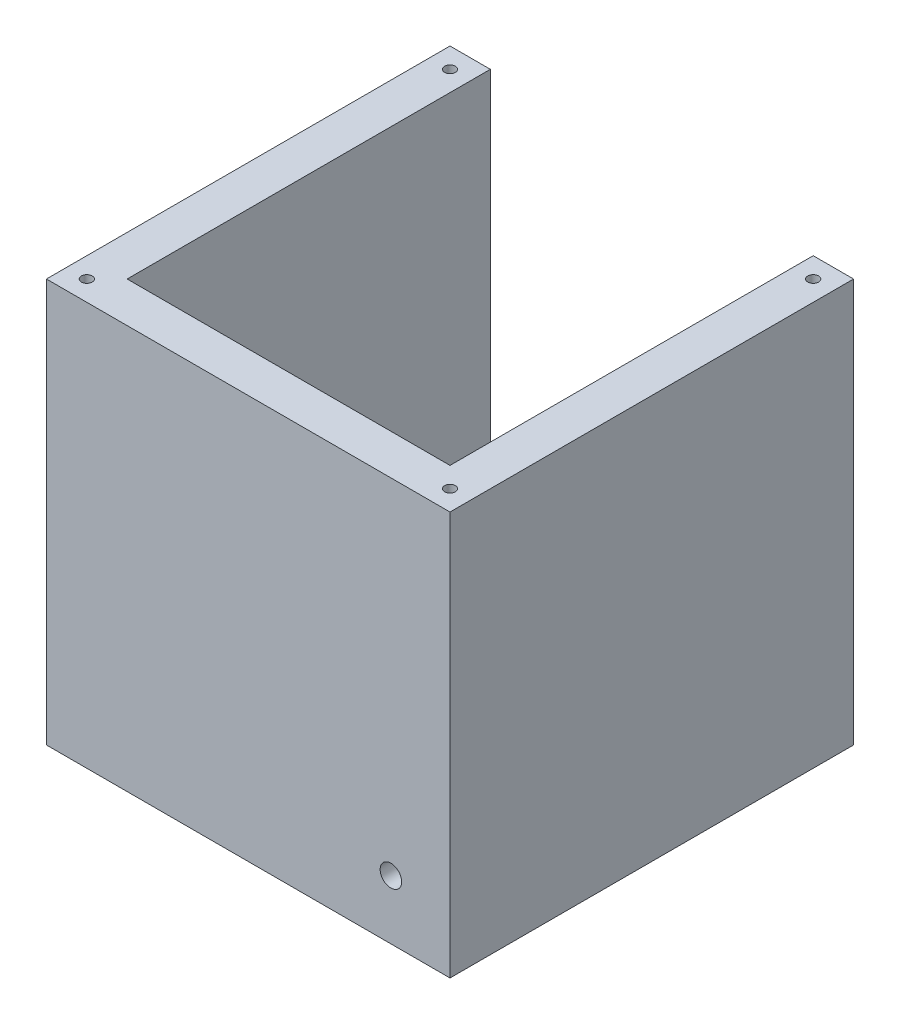
ISO-10303-21;
HEADER;
FILE_DESCRIPTION(('STEP AP214'),'2;1');
FILE_NAME('part.step','',(''),(''),'','','');
FILE_SCHEMA(('AUTOMOTIVE_DESIGN { 1 0 10303 214 1 1 1 1 }'));
ENDSEC;
DATA;
#1=APPLICATION_CONTEXT('core data for automotive mechanical design processes');
#2=APPLICATION_PROTOCOL_DEFINITION('international standard','automotive_design',2000,#1);
#3=PRODUCT_CONTEXT('',#1,'mechanical');
#4=PRODUCT('Part','Part','',(#3));
#5=PRODUCT_RELATED_PRODUCT_CATEGORY('part','',(#4));
#6=PRODUCT_DEFINITION_FORMATION('','',#4);
#7=PRODUCT_DEFINITION_CONTEXT('part definition',#1,'design');
#8=PRODUCT_DEFINITION('design','',#6,#7);
#9=PRODUCT_DEFINITION_SHAPE('','',#8);
#10=(LENGTH_UNIT() NAMED_UNIT(*) SI_UNIT(.MILLI.,.METRE.));
#11=(NAMED_UNIT(*) PLANE_ANGLE_UNIT() SI_UNIT($,.RADIAN.));
#12=(NAMED_UNIT(*) SI_UNIT($,.STERADIAN.) SOLID_ANGLE_UNIT());
#13=UNCERTAINTY_MEASURE_WITH_UNIT(LENGTH_MEASURE(1.E-05),#10,'distance_accuracy_value','');
#14=(GEOMETRIC_REPRESENTATION_CONTEXT(3) GLOBAL_UNCERTAINTY_ASSIGNED_CONTEXT((#13)) GLOBAL_UNIT_ASSIGNED_CONTEXT((#10,
#11,#12)) REPRESENTATION_CONTEXT('',''));
#15=CARTESIAN_POINT('',(0.,0.,0.));
#16=DIRECTION('',(0.,0.,1.));
#17=DIRECTION('',(1.,0.,0.));
#18=AXIS2_PLACEMENT_3D('',#15,#16,#17);
#19=CARTESIAN_POINT('',(67.4999999999995,65.,7.49999999999998));
#20=DIRECTION('',(0.,1.,0.));
#21=DIRECTION('',(0.,0.,1.));
#22=AXIS2_PLACEMENT_3D('',#19,#20,#21);
#23=CYLINDRICAL_SURFACE('',#22,2.00000000000001);
#24=CARTESIAN_POINT('',(67.4999999999995,75.,7.49999999999998));
#25=DIRECTION('',(0.,1.,0.));
#26=DIRECTION('',(0.,0.,1.));
#27=AXIS2_PLACEMENT_3D('',#24,#25,#26);
#28=CIRCLE('',#27,2.00000000000001);
#29=CARTESIAN_POINT('',(67.4999999999995,75.,9.49999999999999));
#30=VERTEX_POINT('',#29);
#31=EDGE_CURVE('E202',#30,#30,#28,.T.);
#32=ORIENTED_EDGE('',*,*,#31,.T.);
#33=EDGE_LOOP('',(#32));
#34=FACE_BOUND('',#33,.T.);
#35=CARTESIAN_POINT('',(67.5,67.5,7.49999999999998));
#36=DIRECTION('',(0.,0.707106781186547,0.707106781186547));
#37=DIRECTION('',(0.,0.707106781186547,-0.707106781186547));
#38=AXIS2_PLACEMENT_3D('',#35,#36,#37);
#39=ELLIPSE('',#38,2.8284271247462,2.00000000000001);
#40=CARTESIAN_POINT('',(65.5,67.5,7.49999999999998));
#41=VERTEX_POINT('',#40);
#42=CARTESIAN_POINT('',(69.5,67.5,7.49999999999998));
#43=VERTEX_POINT('',#42);
#44=EDGE_CURVE('E46',#41,#43,#39,.F.);
#45=ORIENTED_EDGE('',*,*,#44,.T.);
#46=CARTESIAN_POINT('',(67.5,67.5,7.49999999999998));
#47=DIRECTION('',(0.,0.707106781186547,-0.707106781186547));
#48=DIRECTION('',(0.,0.707106781186547,0.707106781186547));
#49=AXIS2_PLACEMENT_3D('',#46,#47,#48);
#50=ELLIPSE('',#49,2.8284271247462,2.00000000000001);
#51=EDGE_CURVE('E11',#43,#41,#50,.F.);
#52=ORIENTED_EDGE('',*,*,#51,.T.);
#53=EDGE_LOOP('',(#45,#52));
#54=FACE_BOUND('',#53,.T.);
#55=ADVANCED_FACE('F33',(#34,#54),#23,.F.);
#56=CARTESIAN_POINT('',(-67.5000000000005,65.,7.49999999999998));
#57=DIRECTION('',(0.,1.,0.));
#58=DIRECTION('',(0.,0.,1.));
#59=AXIS2_PLACEMENT_3D('',#56,#57,#58);
#60=CYLINDRICAL_SURFACE('',#59,2.00000000000001);
#61=CARTESIAN_POINT('',(-67.5000000000005,75.,7.49999999999998));
#62=DIRECTION('',(0.,1.,0.));
#63=DIRECTION('',(0.,0.,1.));
#64=AXIS2_PLACEMENT_3D('',#61,#62,#63);
#65=CIRCLE('',#64,2.00000000000001);
#66=CARTESIAN_POINT('',(-67.5000000000005,75.,9.49999999999999));
#67=VERTEX_POINT('',#66);
#68=EDGE_CURVE('E208',#67,#67,#65,.T.);
#69=ORIENTED_EDGE('',*,*,#68,.T.);
#70=EDGE_LOOP('',(#69));
#71=FACE_BOUND('',#70,.T.);
#72=CARTESIAN_POINT('',(-67.5,67.5,7.49999999999998));
#73=DIRECTION('',(0.,0.707106781186547,0.707106781186547));
#74=DIRECTION('',(0.,0.707106781186547,-0.707106781186547));
#75=AXIS2_PLACEMENT_3D('',#72,#73,#74);
#76=ELLIPSE('',#75,2.8284271247462,2.00000000000001);
#77=CARTESIAN_POINT('',(-69.5,67.5,7.49999999999998));
#78=VERTEX_POINT('',#77);
#79=CARTESIAN_POINT('',(-65.5,67.5,7.49999999999998));
#80=VERTEX_POINT('',#79);
#81=EDGE_CURVE('E53',#78,#80,#76,.F.);
#82=ORIENTED_EDGE('',*,*,#81,.T.);
#83=CARTESIAN_POINT('',(-67.5,67.5,7.49999999999998));
#84=DIRECTION('',(0.,0.707106781186547,-0.707106781186547));
#85=DIRECTION('',(0.,0.707106781186547,0.707106781186547));
#86=AXIS2_PLACEMENT_3D('',#83,#84,#85);
#87=ELLIPSE('',#86,2.8284271247462,2.00000000000001);
#88=EDGE_CURVE('E118',#80,#78,#87,.F.);
#89=ORIENTED_EDGE('',*,*,#88,.T.);
#90=EDGE_LOOP('',(#82,#89));
#91=FACE_BOUND('',#90,.T.);
#92=ADVANCED_FACE('F304',(#71,#91),#60,.F.);
#93=CARTESIAN_POINT('',(-75.,75.,150.));
#94=DIRECTION('',(0.,-1.,0.));
#95=DIRECTION('',(0.,0.,-1.));
#96=AXIS2_PLACEMENT_3D('',#93,#94,#95);
#97=PLANE('',#96);
#98=ORIENTED_EDGE('',*,*,#68,.F.);
#99=EDGE_LOOP('',(#98));
#100=FACE_BOUND('',#99,.T.);
#101=ORIENTED_EDGE('',*,*,#31,.F.);
#102=EDGE_LOOP('',(#101));
#103=FACE_BOUND('',#102,.T.);
#104=CARTESIAN_POINT('',(67.5,75.,142.5));
#105=DIRECTION('',(0.,1.,0.));
#106=DIRECTION('',(0.,0.,1.));
#107=AXIS2_PLACEMENT_3D('',#104,#105,#106);
#108=CIRCLE('',#107,2.00000000000001);
#109=CARTESIAN_POINT('',(67.5,75.,144.5));
#110=VERTEX_POINT('',#109);
#111=EDGE_CURVE('E196',#110,#110,#108,.T.);
#112=ORIENTED_EDGE('',*,*,#111,.F.);
#113=EDGE_LOOP('',(#112));
#114=FACE_BOUND('',#113,.T.);
#115=CARTESIAN_POINT('',(-67.5,75.,142.5));
#116=DIRECTION('',(0.,1.,0.));
#117=DIRECTION('',(0.,0.,1.));
#118=AXIS2_PLACEMENT_3D('',#115,#116,#117);
#119=CIRCLE('',#118,2.00000000000001);
#120=CARTESIAN_POINT('',(-67.5,75.,144.5));
#121=VERTEX_POINT('',#120);
#122=EDGE_CURVE('E193',#121,#121,#119,.T.);
#123=ORIENTED_EDGE('',*,*,#122,.F.);
#124=EDGE_LOOP('',(#123));
#125=FACE_BOUND('',#124,.T.);
#126=DIRECTION('',(0.,0.,-1.));
#127=VECTOR('',#126,1.);
#128=CARTESIAN_POINT('',(-60.,75.,135.));
#129=LINE('',#128,#127);
#130=CARTESIAN_POINT('',(-60.,75.,135.));
#131=VERTEX_POINT('',#130);
#132=CARTESIAN_POINT('',(-60.,75.,0.));
#133=VERTEX_POINT('',#132);
#134=EDGE_CURVE('E164',#131,#133,#129,.T.);
#135=ORIENTED_EDGE('',*,*,#134,.T.);
#136=DIRECTION('',(-1.,0.,0.));
#137=VECTOR('',#136,1.);
#138=CARTESIAN_POINT('',(-75.,75.,0.));
#139=LINE('',#138,#137);
#140=CARTESIAN_POINT('',(-75.,75.,0.));
#141=VERTEX_POINT('',#140);
#142=EDGE_CURVE('E152',#133,#141,#139,.T.);
#143=ORIENTED_EDGE('',*,*,#142,.T.);
#144=DIRECTION('',(0.,0.,-1.));
#145=VECTOR('',#144,1.);
#146=CARTESIAN_POINT('',(-75.,75.,150.));
#147=LINE('',#146,#145);
#148=CARTESIAN_POINT('',(-75.,75.,150.));
#149=VERTEX_POINT('',#148);
#150=EDGE_CURVE('E134',#149,#141,#147,.T.);
#151=ORIENTED_EDGE('',*,*,#150,.F.);
#152=DIRECTION('',(-1.,0.,0.));
#153=VECTOR('',#152,1.);
#154=CARTESIAN_POINT('',(-75.,75.,150.));
#155=LINE('',#154,#153);
#156=CARTESIAN_POINT('',(75.,75.,150.));
#157=VERTEX_POINT('',#156);
#158=EDGE_CURVE('E160',#157,#149,#155,.T.);
#159=ORIENTED_EDGE('',*,*,#158,.F.);
#160=DIRECTION('',(0.,0.,-1.));
#161=VECTOR('',#160,1.);
#162=CARTESIAN_POINT('',(75.,75.,150.));
#163=LINE('',#162,#161);
#164=CARTESIAN_POINT('',(75.,75.,0.));
#165=VERTEX_POINT('',#164);
#166=EDGE_CURVE('E131',#157,#165,#163,.T.);
#167=ORIENTED_EDGE('',*,*,#166,.T.);
#168=CARTESIAN_POINT('',(60.,75.,0.));
#169=VERTEX_POINT('',#168);
#170=EDGE_CURVE('E149',#165,#169,#139,.T.);
#171=ORIENTED_EDGE('',*,*,#170,.T.);
#172=DIRECTION('',(0.,0.,-1.));
#173=VECTOR('',#172,1.);
#174=CARTESIAN_POINT('',(60.,75.,135.));
#175=LINE('',#174,#173);
#176=CARTESIAN_POINT('',(60.,75.,135.));
#177=VERTEX_POINT('',#176);
#178=EDGE_CURVE('E167',#177,#169,#175,.T.);
#179=ORIENTED_EDGE('',*,*,#178,.F.);
#180=DIRECTION('',(1.,0.,0.));
#181=VECTOR('',#180,1.);
#182=CARTESIAN_POINT('',(0.,75.,135.));
#183=LINE('',#182,#181);
#184=EDGE_CURVE('E188',#131,#177,#183,.T.);
#185=ORIENTED_EDGE('',*,*,#184,.F.);
#186=EDGE_LOOP('',(#135,#143,#151,#159,#167,#171,#179,#185));
#187=FACE_BOUND('',#186,.T.);
#188=ADVANCED_FACE('F271',(#100,#103,#114,#125,#187),#97,.F.);
#189=CARTESIAN_POINT('',(0.,0.,0.));
#190=DIRECTION('',(0.,0.,-1.));
#191=DIRECTION('',(-1.,0.,0.));
#192=AXIS2_PLACEMENT_3D('',#189,#190,#191);
#193=PLANE('',#192);
#194=CARTESIAN_POINT('',(67.5000000000005,67.5,0.));
#195=DIRECTION('',(0.,0.,-1.));
#196=DIRECTION('',(-1.,0.,0.));
#197=AXIS2_PLACEMENT_3D('',#194,#195,#196);
#198=CIRCLE('',#197,2.00000000000001);
#199=CARTESIAN_POINT('',(65.5000000000004,67.5,0.));
#200=VERTEX_POINT('',#199);
#201=EDGE_CURVE('E232',#200,#200,#198,.T.);
#202=ORIENTED_EDGE('',*,*,#201,.F.);
#203=EDGE_LOOP('',(#202));
#204=FACE_BOUND('',#203,.T.);
#205=CARTESIAN_POINT('',(-67.4999999999995,67.5,0.));
#206=DIRECTION('',(0.,0.,-1.));
#207=DIRECTION('',(-1.,0.,0.));
#208=AXIS2_PLACEMENT_3D('',#205,#206,#207);
#209=CIRCLE('',#208,2.00000000000001);
#210=CARTESIAN_POINT('',(-69.4999999999996,67.5,0.));
#211=VERTEX_POINT('',#210);
#212=EDGE_CURVE('E226',#211,#211,#209,.T.);
#213=ORIENTED_EDGE('',*,*,#212,.F.);
#214=EDGE_LOOP('',(#213));
#215=FACE_BOUND('',#214,.T.);
#216=CARTESIAN_POINT('',(-67.5,-67.5,0.));
#217=DIRECTION('',(0.,0.,-1.));
#218=DIRECTION('',(-1.,0.,0.));
#219=AXIS2_PLACEMENT_3D('',#216,#217,#218);
#220=CIRCLE('',#219,2.00000000000001);
#221=CARTESIAN_POINT('',(-69.5,-67.5,0.));
#222=VERTEX_POINT('',#221);
#223=EDGE_CURVE('E220',#222,#222,#220,.T.);
#224=ORIENTED_EDGE('',*,*,#223,.F.);
#225=EDGE_LOOP('',(#224));
#226=FACE_BOUND('',#225,.T.);
#227=CARTESIAN_POINT('',(67.5,-67.5,0.));
#228=DIRECTION('',(0.,0.,-1.));
#229=DIRECTION('',(-1.,0.,0.));
#230=AXIS2_PLACEMENT_3D('',#227,#228,#229);
#231=CIRCLE('',#230,2.00000000000001);
#232=CARTESIAN_POINT('',(65.5,-67.5,0.));
#233=VERTEX_POINT('',#232);
#234=EDGE_CURVE('E217',#233,#233,#231,.T.);
#235=ORIENTED_EDGE('',*,*,#234,.F.);
#236=EDGE_LOOP('',(#235));
#237=FACE_BOUND('',#236,.T.);
#238=ORIENTED_EDGE('',*,*,#142,.F.);
#239=DIRECTION('',(0.,-1.,0.));
#240=VECTOR('',#239,1.);
#241=CARTESIAN_POINT('',(-60.,0.,0.));
#242=LINE('',#241,#240);
#243=CARTESIAN_POINT('',(-60.,-60.,0.));
#244=VERTEX_POINT('',#243);
#245=EDGE_CURVE('E181',#133,#244,#242,.T.);
#246=ORIENTED_EDGE('',*,*,#245,.T.);
#247=DIRECTION('',(1.,0.,0.));
#248=VECTOR('',#247,1.);
#249=CARTESIAN_POINT('',(0.,-60.,0.));
#250=LINE('',#249,#248);
#251=CARTESIAN_POINT('',(60.,-60.,0.));
#252=VERTEX_POINT('',#251);
#253=EDGE_CURVE('E174',#244,#252,#250,.T.);
#254=ORIENTED_EDGE('',*,*,#253,.T.);
#255=DIRECTION('',(0.,1.,0.));
#256=VECTOR('',#255,1.);
#257=CARTESIAN_POINT('',(60.,0.,0.));
#258=LINE('',#257,#256);
#259=EDGE_CURVE('E178',#252,#169,#258,.T.);
#260=ORIENTED_EDGE('',*,*,#259,.T.);
#261=ORIENTED_EDGE('',*,*,#170,.F.);
#262=DIRECTION('',(0.,1.,0.));
#263=VECTOR('',#262,1.);
#264=CARTESIAN_POINT('',(75.,-75.,0.));
#265=LINE('',#264,#263);
#266=CARTESIAN_POINT('',(75.,-75.,0.));
#267=VERTEX_POINT('',#266);
#268=EDGE_CURVE('E153',#267,#165,#265,.T.);
#269=ORIENTED_EDGE('',*,*,#268,.F.);
#270=DIRECTION('',(1.,0.,0.));
#271=VECTOR('',#270,1.);
#272=CARTESIAN_POINT('',(-75.,-75.,0.));
#273=LINE('',#272,#271);
#274=CARTESIAN_POINT('',(-75.,-75.,0.));
#275=VERTEX_POINT('',#274);
#276=EDGE_CURVE('E144',#275,#267,#273,.T.);
#277=ORIENTED_EDGE('',*,*,#276,.F.);
#278=DIRECTION('',(0.,-1.,0.));
#279=VECTOR('',#278,1.);
#280=CARTESIAN_POINT('',(-75.,-75.,0.));
#281=LINE('',#280,#279);
#282=EDGE_CURVE('E147',#141,#275,#281,.T.);
#283=ORIENTED_EDGE('',*,*,#282,.F.);
#284=EDGE_LOOP('',(#238,#246,#254,#260,#261,#269,#277,#283));
#285=FACE_BOUND('',#284,.T.);
#286=ADVANCED_FACE('F282',(#204,#215,#226,#237,#285),#193,.T.);
#287=CARTESIAN_POINT('',(75.,-75.,150.));
#288=DIRECTION('',(-1.,0.,0.));
#289=DIRECTION('',(0.,-1.,0.));
#290=AXIS2_PLACEMENT_3D('',#287,#288,#289);
#291=PLANE('',#290);
#292=ORIENTED_EDGE('',*,*,#268,.T.);
#293=ORIENTED_EDGE('',*,*,#166,.F.);
#294=DIRECTION('',(0.,1.,0.));
#295=VECTOR('',#294,1.);
#296=CARTESIAN_POINT('',(75.,-75.,150.));
#297=LINE('',#296,#295);
#298=CARTESIAN_POINT('',(75.,-75.,150.));
#299=VERTEX_POINT('',#298);
#300=EDGE_CURVE('E146',#299,#157,#297,.T.);
#301=ORIENTED_EDGE('',*,*,#300,.F.);
#302=DIRECTION('',(0.,0.,-1.));
#303=VECTOR('',#302,1.);
#304=CARTESIAN_POINT('',(75.,-75.,150.));
#305=LINE('',#304,#303);
#306=EDGE_CURVE('E140',#299,#267,#305,.T.);
#307=ORIENTED_EDGE('',*,*,#306,.T.);
#308=EDGE_LOOP('',(#292,#293,#301,#307));
#309=FACE_BOUND('',#308,.T.);
#310=ADVANCED_FACE('F35',(#309),#291,.F.);
#311=CARTESIAN_POINT('',(-75.,-75.,150.));
#312=DIRECTION('',(1.,0.,0.));
#313=DIRECTION('',(0.,1.,0.));
#314=AXIS2_PLACEMENT_3D('',#311,#312,#313);
#315=PLANE('',#314);
#316=ORIENTED_EDGE('',*,*,#282,.T.);
#317=DIRECTION('',(0.,0.,-1.));
#318=VECTOR('',#317,1.);
#319=CARTESIAN_POINT('',(-75.,-75.,150.));
#320=LINE('',#319,#318);
#321=CARTESIAN_POINT('',(-75.,-75.,150.));
#322=VERTEX_POINT('',#321);
#323=EDGE_CURVE('E137',#322,#275,#320,.T.);
#324=ORIENTED_EDGE('',*,*,#323,.F.);
#325=DIRECTION('',(0.,-1.,0.));
#326=VECTOR('',#325,1.);
#327=CARTESIAN_POINT('',(-75.,-75.,150.));
#328=LINE('',#327,#326);
#329=EDGE_CURVE('E158',#149,#322,#328,.T.);
#330=ORIENTED_EDGE('',*,*,#329,.F.);
#331=ORIENTED_EDGE('',*,*,#150,.T.);
#332=EDGE_LOOP('',(#316,#324,#330,#331));
#333=FACE_BOUND('',#332,.T.);
#334=ADVANCED_FACE('F278',(#333),#315,.F.);
#335=CARTESIAN_POINT('',(-75.,-75.,150.));
#336=DIRECTION('',(0.,1.,0.));
#337=DIRECTION('',(0.,0.,1.));
#338=AXIS2_PLACEMENT_3D('',#335,#336,#337);
#339=PLANE('',#338);
#340=ORIENTED_EDGE('',*,*,#276,.T.);
#341=ORIENTED_EDGE('',*,*,#306,.F.);
#342=DIRECTION('',(1.,0.,0.));
#343=VECTOR('',#342,1.);
#344=CARTESIAN_POINT('',(-75.,-75.,150.));
#345=LINE('',#344,#343);
#346=EDGE_CURVE('E143',#322,#299,#345,.T.);
#347=ORIENTED_EDGE('',*,*,#346,.F.);
#348=ORIENTED_EDGE('',*,*,#323,.T.);
#349=EDGE_LOOP('',(#340,#341,#347,#348));
#350=FACE_BOUND('',#349,.T.);
#351=ADVANCED_FACE('F261',(#350),#339,.F.);
#352=CARTESIAN_POINT('',(0.,0.,150.));
#353=DIRECTION('',(0.,0.,-1.));
#354=DIRECTION('',(-1.,0.,0.));
#355=AXIS2_PLACEMENT_3D('',#352,#353,#354);
#356=PLANE('',#355);
#357=CARTESIAN_POINT('',(53.0330085889911,-53.0330085889911,150.));
#358=DIRECTION('',(0.,0.,1.));
#359=DIRECTION('',(1.,0.,0.));
#360=AXIS2_PLACEMENT_3D('',#357,#358,#359);
#361=CIRCLE('',#360,4.);
#362=CARTESIAN_POINT('',(57.0330085889911,-53.0330085889911,150.));
#363=VERTEX_POINT('',#362);
#364=EDGE_CURVE('E241',#363,#363,#361,.T.);
#365=ORIENTED_EDGE('',*,*,#364,.F.);
#366=EDGE_LOOP('',(#365));
#367=FACE_BOUND('',#366,.T.);
#368=ORIENTED_EDGE('',*,*,#300,.T.);
#369=ORIENTED_EDGE('',*,*,#158,.T.);
#370=ORIENTED_EDGE('',*,*,#329,.T.);
#371=ORIENTED_EDGE('',*,*,#346,.T.);
#372=EDGE_LOOP('',(#368,#369,#370,#371));
#373=FACE_BOUND('',#372,.T.);
#374=ADVANCED_FACE('F257',(#367,#373),#356,.F.);
#375=CARTESIAN_POINT('',(-60.,0.,135.));
#376=DIRECTION('',(1.,0.,0.));
#377=DIRECTION('',(0.,0.,-1.));
#378=AXIS2_PLACEMENT_3D('',#375,#376,#377);
#379=PLANE('',#378);
#380=ORIENTED_EDGE('',*,*,#245,.F.);
#381=ORIENTED_EDGE('',*,*,#134,.F.);
#382=DIRECTION('',(0.,-1.,0.));
#383=VECTOR('',#382,1.);
#384=CARTESIAN_POINT('',(-60.,0.,135.));
#385=LINE('',#384,#383);
#386=CARTESIAN_POINT('',(-60.,-60.,135.));
#387=VERTEX_POINT('',#386);
#388=EDGE_CURVE('E177',#131,#387,#385,.T.);
#389=ORIENTED_EDGE('',*,*,#388,.T.);
#390=DIRECTION('',(0.,0.,-1.));
#391=VECTOR('',#390,1.);
#392=CARTESIAN_POINT('',(-60.,-60.,135.));
#393=LINE('',#392,#391);
#394=EDGE_CURVE('E156',#387,#244,#393,.T.);
#395=ORIENTED_EDGE('',*,*,#394,.T.);
#396=EDGE_LOOP('',(#380,#381,#389,#395));
#397=FACE_BOUND('',#396,.T.);
#398=ADVANCED_FACE('F260',(#397),#379,.T.);
#399=CARTESIAN_POINT('',(0.,-60.,135.));
#400=DIRECTION('',(0.,1.,0.));
#401=DIRECTION('',(0.,0.,1.));
#402=AXIS2_PLACEMENT_3D('',#399,#400,#401);
#403=PLANE('',#402);
#404=ORIENTED_EDGE('',*,*,#253,.F.);
#405=ORIENTED_EDGE('',*,*,#394,.F.);
#406=DIRECTION('',(1.,0.,0.));
#407=VECTOR('',#406,1.);
#408=CARTESIAN_POINT('',(0.,-60.,135.));
#409=LINE('',#408,#407);
#410=CARTESIAN_POINT('',(60.,-60.,135.));
#411=VERTEX_POINT('',#410);
#412=EDGE_CURVE('E168',#387,#411,#409,.T.);
#413=ORIENTED_EDGE('',*,*,#412,.T.);
#414=DIRECTION('',(0.,0.,-1.));
#415=VECTOR('',#414,1.);
#416=CARTESIAN_POINT('',(60.,-60.,135.));
#417=LINE('',#416,#415);
#418=EDGE_CURVE('E170',#411,#252,#417,.T.);
#419=ORIENTED_EDGE('',*,*,#418,.T.);
#420=EDGE_LOOP('',(#404,#405,#413,#419));
#421=FACE_BOUND('',#420,.T.);
#422=ADVANCED_FACE('F293',(#421),#403,.T.);
#423=CARTESIAN_POINT('',(60.,0.,135.));
#424=DIRECTION('',(-1.,0.,0.));
#425=DIRECTION('',(0.,0.,1.));
#426=AXIS2_PLACEMENT_3D('',#423,#424,#425);
#427=PLANE('',#426);
#428=ORIENTED_EDGE('',*,*,#259,.F.);
#429=ORIENTED_EDGE('',*,*,#418,.F.);
#430=DIRECTION('',(0.,1.,0.));
#431=VECTOR('',#430,1.);
#432=CARTESIAN_POINT('',(60.,0.,135.));
#433=LINE('',#432,#431);
#434=EDGE_CURVE('E186',#411,#177,#433,.T.);
#435=ORIENTED_EDGE('',*,*,#434,.T.);
#436=ORIENTED_EDGE('',*,*,#178,.T.);
#437=EDGE_LOOP('',(#428,#429,#435,#436));
#438=FACE_BOUND('',#437,.T.);
#439=ADVANCED_FACE('F286',(#438),#427,.T.);
#440=CARTESIAN_POINT('',(0.,0.,135.));
#441=DIRECTION('',(0.,0.,-1.));
#442=DIRECTION('',(-1.,0.,0.));
#443=AXIS2_PLACEMENT_3D('',#440,#441,#442);
#444=PLANE('',#443);
#445=CARTESIAN_POINT('',(53.0330085889911,-53.0330085889911,135.));
#446=DIRECTION('',(0.,0.,1.));
#447=DIRECTION('',(1.,0.,0.));
#448=AXIS2_PLACEMENT_3D('',#445,#446,#447);
#449=CIRCLE('',#448,4.);
#450=CARTESIAN_POINT('',(57.0330085889911,-53.0330085889911,135.));
#451=VERTEX_POINT('',#450);
#452=EDGE_CURVE('E238',#451,#451,#449,.T.);
#453=ORIENTED_EDGE('',*,*,#452,.T.);
#454=EDGE_LOOP('',(#453));
#455=FACE_BOUND('',#454,.T.);
#456=ORIENTED_EDGE('',*,*,#388,.F.);
#457=ORIENTED_EDGE('',*,*,#184,.T.);
#458=ORIENTED_EDGE('',*,*,#434,.F.);
#459=ORIENTED_EDGE('',*,*,#412,.F.);
#460=EDGE_LOOP('',(#456,#457,#458,#459));
#461=FACE_BOUND('',#460,.T.);
#462=ADVANCED_FACE('F247',(#455,#461),#444,.T.);
#463=CARTESIAN_POINT('',(-67.5,65.,142.5));
#464=DIRECTION('',(0.,1.,0.));
#465=DIRECTION('',(0.,0.,1.));
#466=AXIS2_PLACEMENT_3D('',#463,#464,#465);
#467=CYLINDRICAL_SURFACE('',#466,2.00000000000001);
#468=CARTESIAN_POINT('',(-67.5,65.,142.5));
#469=DIRECTION('',(0.,1.,0.));
#470=DIRECTION('',(0.,0.,1.));
#471=AXIS2_PLACEMENT_3D('',#468,#469,#470);
#472=CIRCLE('',#471,2.00000000000001);
#473=CARTESIAN_POINT('',(-67.5,65.,144.5));
#474=VERTEX_POINT('',#473);
#475=EDGE_CURVE('E184',#474,#474,#472,.T.);
#476=ORIENTED_EDGE('',*,*,#475,.F.);
#477=EDGE_LOOP('',(#476));
#478=FACE_BOUND('',#477,.T.);
#479=ORIENTED_EDGE('',*,*,#122,.T.);
#480=EDGE_LOOP('',(#479));
#481=FACE_BOUND('',#480,.T.);
#482=ADVANCED_FACE('F342',(#478,#481),#467,.F.);
#483=CARTESIAN_POINT('',(-67.5,65.,142.5));
#484=DIRECTION('',(0.,1.,0.));
#485=DIRECTION('',(0.,0.,1.));
#486=AXIS2_PLACEMENT_3D('',#483,#484,#485);
#487=PLANE('',#486);
#488=ORIENTED_EDGE('',*,*,#475,.T.);
#489=EDGE_LOOP('',(#488));
#490=FACE_BOUND('',#489,.T.);
#491=ADVANCED_FACE('F334',(#490),#487,.T.);
#492=CARTESIAN_POINT('',(67.5,65.,142.5));
#493=DIRECTION('',(0.,1.,0.));
#494=DIRECTION('',(0.,0.,1.));
#495=AXIS2_PLACEMENT_3D('',#492,#493,#494);
#496=CYLINDRICAL_SURFACE('',#495,2.00000000000001);
#497=CARTESIAN_POINT('',(67.5,65.,142.5));
#498=DIRECTION('',(0.,1.,0.));
#499=DIRECTION('',(0.,0.,1.));
#500=AXIS2_PLACEMENT_3D('',#497,#498,#499);
#501=CIRCLE('',#500,2.00000000000001);
#502=CARTESIAN_POINT('',(67.5,65.,144.5));
#503=VERTEX_POINT('',#502);
#504=EDGE_CURVE('E199',#503,#503,#501,.T.);
#505=ORIENTED_EDGE('',*,*,#504,.F.);
#506=EDGE_LOOP('',(#505));
#507=FACE_BOUND('',#506,.T.);
#508=ORIENTED_EDGE('',*,*,#111,.T.);
#509=EDGE_LOOP('',(#508));
#510=FACE_BOUND('',#509,.T.);
#511=ADVANCED_FACE('F330',(#507,#510),#496,.F.);
#512=CARTESIAN_POINT('',(67.5,65.,142.5));
#513=DIRECTION('',(0.,1.,0.));
#514=DIRECTION('',(0.,0.,1.));
#515=AXIS2_PLACEMENT_3D('',#512,#513,#514);
#516=PLANE('',#515);
#517=ORIENTED_EDGE('',*,*,#504,.T.);
#518=EDGE_LOOP('',(#517));
#519=FACE_BOUND('',#518,.T.);
#520=ADVANCED_FACE('F333',(#519),#516,.T.);
#521=CARTESIAN_POINT('',(67.5,-67.5,10.));
#522=DIRECTION('',(0.,0.,-1.));
#523=DIRECTION('',(-1.,0.,0.));
#524=AXIS2_PLACEMENT_3D('',#521,#522,#523);
#525=CYLINDRICAL_SURFACE('',#524,2.00000000000001);
#526=CARTESIAN_POINT('',(67.5,-67.5,10.));
#527=DIRECTION('',(0.,0.,-1.));
#528=DIRECTION('',(-1.,0.,0.));
#529=AXIS2_PLACEMENT_3D('',#526,#527,#528);
#530=CIRCLE('',#529,2.00000000000001);
#531=CARTESIAN_POINT('',(65.5,-67.5,10.));
#532=VERTEX_POINT('',#531);
#533=EDGE_CURVE('E214',#532,#532,#530,.T.);
#534=ORIENTED_EDGE('',*,*,#533,.F.);
#535=EDGE_LOOP('',(#534));
#536=FACE_BOUND('',#535,.T.);
#537=ORIENTED_EDGE('',*,*,#234,.T.);
#538=EDGE_LOOP('',(#537));
#539=FACE_BOUND('',#538,.T.);
#540=ADVANCED_FACE('F338',(#536,#539),#525,.F.);
#541=CARTESIAN_POINT('',(67.5,-67.5,10.));
#542=DIRECTION('',(0.,0.,-1.));
#543=DIRECTION('',(-1.,0.,0.));
#544=AXIS2_PLACEMENT_3D('',#541,#542,#543);
#545=PLANE('',#544);
#546=ORIENTED_EDGE('',*,*,#533,.T.);
#547=EDGE_LOOP('',(#546));
#548=FACE_BOUND('',#547,.T.);
#549=ADVANCED_FACE('F376',(#548),#545,.T.);
#550=CARTESIAN_POINT('',(-67.5,-67.5,10.));
#551=DIRECTION('',(0.,0.,-1.));
#552=DIRECTION('',(-1.,0.,0.));
#553=AXIS2_PLACEMENT_3D('',#550,#551,#552);
#554=CYLINDRICAL_SURFACE('',#553,2.00000000000001);
#555=CARTESIAN_POINT('',(-67.5,-67.5,10.));
#556=DIRECTION('',(0.,0.,-1.));
#557=DIRECTION('',(-1.,0.,0.));
#558=AXIS2_PLACEMENT_3D('',#555,#556,#557);
#559=CIRCLE('',#558,2.00000000000001);
#560=CARTESIAN_POINT('',(-69.5,-67.5,10.));
#561=VERTEX_POINT('',#560);
#562=EDGE_CURVE('E223',#561,#561,#559,.T.);
#563=ORIENTED_EDGE('',*,*,#562,.F.);
#564=EDGE_LOOP('',(#563));
#565=FACE_BOUND('',#564,.T.);
#566=ORIENTED_EDGE('',*,*,#223,.T.);
#567=EDGE_LOOP('',(#566));
#568=FACE_BOUND('',#567,.T.);
#569=ADVANCED_FACE('F385',(#565,#568),#554,.F.);
#570=CARTESIAN_POINT('',(-67.5,-67.5,10.));
#571=DIRECTION('',(0.,0.,-1.));
#572=DIRECTION('',(-1.,0.,0.));
#573=AXIS2_PLACEMENT_3D('',#570,#571,#572);
#574=PLANE('',#573);
#575=ORIENTED_EDGE('',*,*,#562,.T.);
#576=EDGE_LOOP('',(#575));
#577=FACE_BOUND('',#576,.T.);
#578=ADVANCED_FACE('F393',(#577),#574,.T.);
#579=CARTESIAN_POINT('',(-67.4999999999995,67.5,10.));
#580=DIRECTION('',(0.,0.,-1.));
#581=DIRECTION('',(-1.,0.,0.));
#582=AXIS2_PLACEMENT_3D('',#579,#580,#581);
#583=CYLINDRICAL_SURFACE('',#582,2.00000000000001);
#584=ORIENTED_EDGE('',*,*,#212,.T.);
#585=EDGE_LOOP('',(#584));
#586=FACE_BOUND('',#585,.T.);
#587=ORIENTED_EDGE('',*,*,#81,.F.);
#588=CARTESIAN_POINT('',(-67.5,67.5,7.49999999999998));
#589=DIRECTION('',(0.,0.707106781186547,-0.707106781186547));
#590=DIRECTION('',(0.,0.707106781186547,0.707106781186547));
#591=AXIS2_PLACEMENT_3D('',#588,#589,#590);
#592=ELLIPSE('',#591,2.8284271247462,2.00000000000001);
#593=EDGE_CURVE('E124',#80,#78,#592,.T.);
#594=ORIENTED_EDGE('',*,*,#593,.F.);
#595=EDGE_LOOP('',(#587,#594));
#596=FACE_BOUND('',#595,.T.);
#597=ADVANCED_FACE('F401',(#586,#596),#583,.F.);
#598=CARTESIAN_POINT('',(-67.5000000000005,65.,7.49999999999998));
#599=DIRECTION('',(0.,1.,0.));
#600=DIRECTION('',(0.,0.,1.));
#601=AXIS2_PLACEMENT_3D('',#598,#599,#600);
#602=PLANE('',#601);
#603=CARTESIAN_POINT('',(-67.5000000000005,65.,7.49999999999998));
#604=DIRECTION('',(0.,1.,0.));
#605=DIRECTION('',(0.,0.,1.));
#606=AXIS2_PLACEMENT_3D('',#603,#604,#605);
#607=CIRCLE('',#606,2.00000000000001);
#608=CARTESIAN_POINT('',(-67.5000000000005,65.,9.49999999999999));
#609=VERTEX_POINT('',#608);
#610=EDGE_CURVE('E211',#609,#609,#607,.T.);
#611=ORIENTED_EDGE('',*,*,#610,.T.);
#612=EDGE_LOOP('',(#611));
#613=FACE_BOUND('',#612,.T.);
#614=ADVANCED_FACE('F409',(#613),#602,.T.);
#615=CARTESIAN_POINT('',(-67.5,67.5,7.49999999999998));
#616=DIRECTION('',(0.,0.707106781186547,0.707106781186547));
#617=DIRECTION('',(0.,0.707106781186547,-0.707106781186547));
#618=AXIS2_PLACEMENT_3D('',#615,#616,#617);
#619=ELLIPSE('',#618,2.8284271247462,2.00000000000001);
#620=EDGE_CURVE('E127',#78,#80,#619,.T.);
#621=ORIENTED_EDGE('',*,*,#620,.T.);
#622=ORIENTED_EDGE('',*,*,#593,.T.);
#623=EDGE_LOOP('',(#621,#622));
#624=FACE_BOUND('',#623,.T.);
#625=ORIENTED_EDGE('',*,*,#610,.F.);
#626=EDGE_LOOP('',(#625));
#627=FACE_BOUND('',#626,.T.);
#628=ADVANCED_FACE('F312',(#624,#627),#60,.F.);
#629=CARTESIAN_POINT('',(-67.4999999999995,67.5,10.));
#630=DIRECTION('',(0.,0.,-1.));
#631=DIRECTION('',(-1.,0.,0.));
#632=AXIS2_PLACEMENT_3D('',#629,#630,#631);
#633=CIRCLE('',#632,2.00000000000001);
#634=CARTESIAN_POINT('',(-69.4999999999996,67.5,10.));
#635=VERTEX_POINT('',#634);
#636=EDGE_CURVE('E229',#635,#635,#633,.T.);
#637=ORIENTED_EDGE('',*,*,#636,.F.);
#638=EDGE_LOOP('',(#637));
#639=FACE_BOUND('',#638,.T.);
#640=ORIENTED_EDGE('',*,*,#620,.F.);
#641=ORIENTED_EDGE('',*,*,#88,.F.);
#642=EDGE_LOOP('',(#640,#641));
#643=FACE_BOUND('',#642,.T.);
#644=ADVANCED_FACE('F412',(#639,#643),#583,.F.);
#645=CARTESIAN_POINT('',(-67.4999999999995,67.5,10.));
#646=DIRECTION('',(0.,0.,-1.));
#647=DIRECTION('',(-1.,0.,0.));
#648=AXIS2_PLACEMENT_3D('',#645,#646,#647);
#649=PLANE('',#648);
#650=ORIENTED_EDGE('',*,*,#636,.T.);
#651=EDGE_LOOP('',(#650));
#652=FACE_BOUND('',#651,.T.);
#653=ADVANCED_FACE('F327',(#652),#649,.T.);
#654=CARTESIAN_POINT('',(67.5000000000005,67.5,10.));
#655=DIRECTION('',(0.,0.,-1.));
#656=DIRECTION('',(-1.,0.,0.));
#657=AXIS2_PLACEMENT_3D('',#654,#655,#656);
#658=CYLINDRICAL_SURFACE('',#657,2.00000000000001);
#659=ORIENTED_EDGE('',*,*,#201,.T.);
#660=EDGE_LOOP('',(#659));
#661=FACE_BOUND('',#660,.T.);
#662=ORIENTED_EDGE('',*,*,#44,.F.);
#663=CARTESIAN_POINT('',(67.5,67.5,7.49999999999998));
#664=DIRECTION('',(0.,0.707106781186547,-0.707106781186547));
#665=DIRECTION('',(0.,0.707106781186547,0.707106781186547));
#666=AXIS2_PLACEMENT_3D('',#663,#664,#665);
#667=ELLIPSE('',#666,2.8284271247462,2.00000000000001);
#668=EDGE_CURVE('E41',#43,#41,#667,.T.);
#669=ORIENTED_EDGE('',*,*,#668,.F.);
#670=EDGE_LOOP('',(#662,#669));
#671=FACE_BOUND('',#670,.T.);
#672=ADVANCED_FACE('F117',(#661,#671),#658,.F.);
#673=CARTESIAN_POINT('',(67.4999999999995,65.,7.49999999999998));
#674=DIRECTION('',(0.,1.,0.));
#675=DIRECTION('',(0.,0.,1.));
#676=AXIS2_PLACEMENT_3D('',#673,#674,#675);
#677=PLANE('',#676);
#678=CARTESIAN_POINT('',(67.4999999999995,65.,7.49999999999998));
#679=DIRECTION('',(0.,1.,0.));
#680=DIRECTION('',(0.,0.,1.));
#681=AXIS2_PLACEMENT_3D('',#678,#679,#680);
#682=CIRCLE('',#681,2.00000000000001);
#683=CARTESIAN_POINT('',(67.4999999999995,65.,9.49999999999999));
#684=VERTEX_POINT('',#683);
#685=EDGE_CURVE('E205',#684,#684,#682,.T.);
#686=ORIENTED_EDGE('',*,*,#685,.T.);
#687=EDGE_LOOP('',(#686));
#688=FACE_BOUND('',#687,.T.);
#689=ADVANCED_FACE('F316',(#688),#677,.T.);
#690=CARTESIAN_POINT('',(67.5,67.5,7.49999999999998));
#691=DIRECTION('',(0.,0.707106781186547,0.707106781186547));
#692=DIRECTION('',(0.,0.707106781186547,-0.707106781186547));
#693=AXIS2_PLACEMENT_3D('',#690,#691,#692);
#694=ELLIPSE('',#693,2.8284271247462,2.00000000000001);
#695=EDGE_CURVE('E111',#41,#43,#694,.T.);
#696=ORIENTED_EDGE('',*,*,#695,.T.);
#697=ORIENTED_EDGE('',*,*,#668,.T.);
#698=EDGE_LOOP('',(#696,#697));
#699=FACE_BOUND('',#698,.T.);
#700=ORIENTED_EDGE('',*,*,#685,.F.);
#701=EDGE_LOOP('',(#700));
#702=FACE_BOUND('',#701,.T.);
#703=ADVANCED_FACE('F120',(#699,#702),#23,.F.);
#704=CARTESIAN_POINT('',(67.5000000000005,67.5,10.));
#705=DIRECTION('',(0.,0.,-1.));
#706=DIRECTION('',(-1.,0.,0.));
#707=AXIS2_PLACEMENT_3D('',#704,#705,#706);
#708=CIRCLE('',#707,2.00000000000001);
#709=CARTESIAN_POINT('',(65.5000000000004,67.5,10.));
#710=VERTEX_POINT('',#709);
#711=EDGE_CURVE('E235',#710,#710,#708,.T.);
#712=ORIENTED_EDGE('',*,*,#711,.F.);
#713=EDGE_LOOP('',(#712));
#714=FACE_BOUND('',#713,.T.);
#715=ORIENTED_EDGE('',*,*,#695,.F.);
#716=ORIENTED_EDGE('',*,*,#51,.F.);
#717=EDGE_LOOP('',(#715,#716));
#718=FACE_BOUND('',#717,.T.);
#719=ADVANCED_FACE('F112',(#714,#718),#658,.F.);
#720=CARTESIAN_POINT('',(67.5000000000005,67.5,10.));
#721=DIRECTION('',(0.,0.,-1.));
#722=DIRECTION('',(-1.,0.,0.));
#723=AXIS2_PLACEMENT_3D('',#720,#721,#722);
#724=PLANE('',#723);
#725=ORIENTED_EDGE('',*,*,#711,.T.);
#726=EDGE_LOOP('',(#725));
#727=FACE_BOUND('',#726,.T.);
#728=ADVANCED_FACE('F253',(#727),#724,.T.);
#729=CARTESIAN_POINT('',(53.0330085889911,-53.0330085889911,135.));
#730=DIRECTION('',(0.,0.,1.));
#731=DIRECTION('',(1.,0.,0.));
#732=AXIS2_PLACEMENT_3D('',#729,#730,#731);
#733=CYLINDRICAL_SURFACE('',#732,4.);
#734=ORIENTED_EDGE('',*,*,#452,.F.);
#735=EDGE_LOOP('',(#734));
#736=FACE_BOUND('',#735,.T.);
#737=ORIENTED_EDGE('',*,*,#364,.T.);
#738=EDGE_LOOP('',(#737));
#739=FACE_BOUND('',#738,.T.);
#740=ADVANCED_FACE('F250',(#736,#739),#733,.F.);
#741=CLOSED_SHELL('',(#55,#92,#188,#286,#310,#334,#351,#374,#398,#422,#439,#462,#482,#491,#511,
#520,#540,#549,#569,#578,#597,#614,#628,#644,#653,#672,#689,#703,#719,#728,#740));
#742=MANIFOLD_SOLID_BREP('B2',#741);
#743=ADVANCED_BREP_SHAPE_REPRESENTATION('',(#18,#742),#14);
#744=SHAPE_DEFINITION_REPRESENTATION(#9,#743);
ENDSEC;
END-ISO-10303-21;
